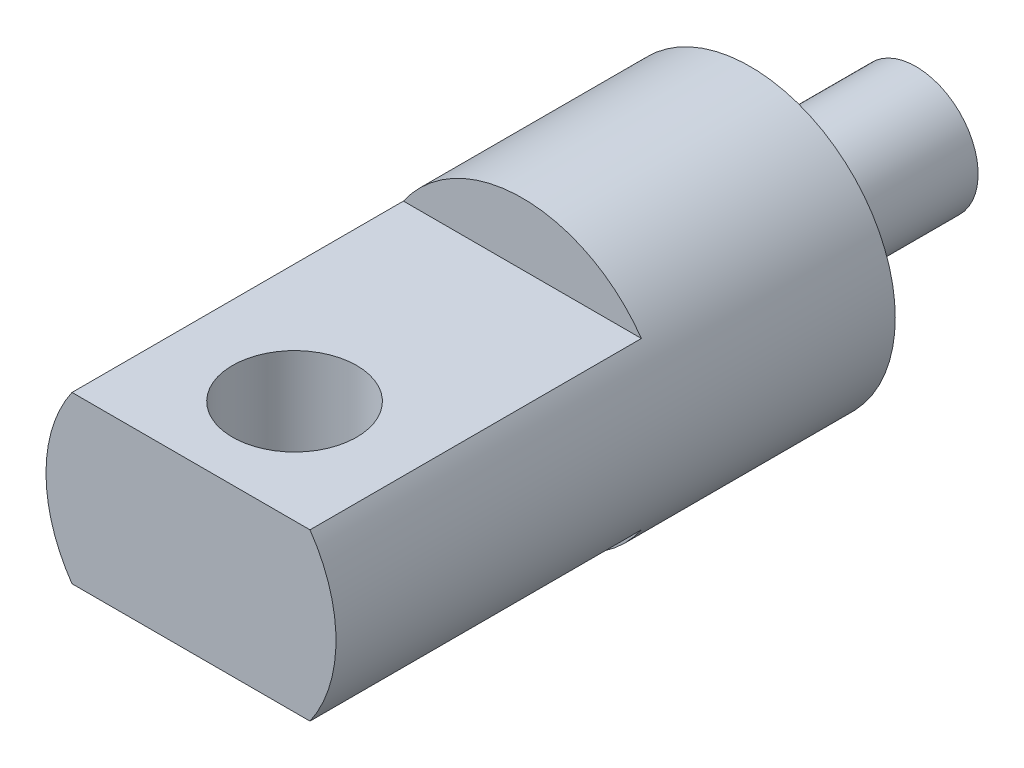
ISO-10303-21;
HEADER;
FILE_DESCRIPTION(('STEP AP214'),'2;1');
FILE_NAME('part.step','',(''),(''),'','','');
FILE_SCHEMA(('AUTOMOTIVE_DESIGN { 1 0 10303 214 1 1 1 1 }'));
ENDSEC;
DATA;
#1=APPLICATION_CONTEXT('core data for automotive mechanical design processes');
#2=APPLICATION_PROTOCOL_DEFINITION('international standard','automotive_design',2000,#1);
#3=PRODUCT_CONTEXT('',#1,'mechanical');
#4=PRODUCT('Part','Part','',(#3));
#5=PRODUCT_RELATED_PRODUCT_CATEGORY('part','',(#4));
#6=PRODUCT_DEFINITION_FORMATION('','',#4);
#7=PRODUCT_DEFINITION_CONTEXT('part definition',#1,'design');
#8=PRODUCT_DEFINITION('design','',#6,#7);
#9=PRODUCT_DEFINITION_SHAPE('','',#8);
#10=(LENGTH_UNIT() NAMED_UNIT(*) SI_UNIT(.MILLI.,.METRE.));
#11=(NAMED_UNIT(*) PLANE_ANGLE_UNIT() SI_UNIT($,.RADIAN.));
#12=(NAMED_UNIT(*) SI_UNIT($,.STERADIAN.) SOLID_ANGLE_UNIT());
#13=UNCERTAINTY_MEASURE_WITH_UNIT(LENGTH_MEASURE(1.E-05),#10,'distance_accuracy_value','');
#14=(GEOMETRIC_REPRESENTATION_CONTEXT(3) GLOBAL_UNCERTAINTY_ASSIGNED_CONTEXT((#13)) GLOBAL_UNIT_ASSIGNED_CONTEXT((#10,
#11,#12)) REPRESENTATION_CONTEXT('',''));
#15=CARTESIAN_POINT('',(0.,0.,0.));
#16=DIRECTION('',(0.,0.,1.));
#17=DIRECTION('',(1.,0.,0.));
#18=AXIS2_PLACEMENT_3D('',#15,#16,#17);
#19=CARTESIAN_POINT('',(0.,0.,25.));
#20=DIRECTION('',(0.,0.,-1.));
#21=DIRECTION('',(-1.,0.,0.));
#22=AXIS2_PLACEMENT_3D('',#19,#20,#21);
#23=CYLINDRICAL_SURFACE('',#22,35.);
#24=CARTESIAN_POINT('',(0.,0.,25.));
#25=DIRECTION('',(0.,0.,1.));
#26=DIRECTION('',(1.,0.,0.));
#27=AXIS2_PLACEMENT_3D('',#24,#25,#26);
#28=CIRCLE('',#27,35.);
#29=CARTESIAN_POINT('',(-28.7228132326902,20.,25.));
#30=VERTEX_POINT('',#29);
#31=CARTESIAN_POINT('',(-28.7228132326902,-20.,25.));
#32=VERTEX_POINT('',#31);
#33=EDGE_CURVE('E11',#30,#32,#28,.T.);
#34=ORIENTED_EDGE('',*,*,#33,.F.);
#35=DIRECTION('',(0.,0.,1.));
#36=VECTOR('',#35,1.);
#37=CARTESIAN_POINT('',(-28.7228132326902,20.,-55.));
#38=LINE('',#37,#36);
#39=CARTESIAN_POINT('',(-28.7228132326902,20.,-55.));
#40=VERTEX_POINT('',#39);
#41=EDGE_CURVE('E62',#40,#30,#38,.T.);
#42=ORIENTED_EDGE('',*,*,#41,.F.);
#43=CARTESIAN_POINT('',(0.,0.,-55.));
#44=DIRECTION('',(0.,0.,1.));
#45=DIRECTION('',(1.,0.,0.));
#46=AXIS2_PLACEMENT_3D('',#43,#44,#45);
#47=CIRCLE('',#46,35.);
#48=CARTESIAN_POINT('',(28.7228132326902,20.,-55.));
#49=VERTEX_POINT('',#48);
#50=EDGE_CURVE('E82',#49,#40,#47,.T.);
#51=ORIENTED_EDGE('',*,*,#50,.F.);
#52=DIRECTION('',(0.,0.,1.));
#53=VECTOR('',#52,1.);
#54=CARTESIAN_POINT('',(28.7228132326902,20.,-55.));
#55=LINE('',#54,#53);
#56=CARTESIAN_POINT('',(28.7228132326902,20.,25.));
#57=VERTEX_POINT('',#56);
#58=EDGE_CURVE('E90',#49,#57,#55,.T.);
#59=ORIENTED_EDGE('',*,*,#58,.T.);
#60=CARTESIAN_POINT('',(28.7228132326902,-20.,25.));
#61=VERTEX_POINT('',#60);
#62=EDGE_CURVE('E47',#61,#57,#28,.T.);
#63=ORIENTED_EDGE('',*,*,#62,.F.);
#64=DIRECTION('',(0.,0.,1.));
#65=VECTOR('',#64,1.);
#66=CARTESIAN_POINT('',(28.7228132326902,-20.,-55.));
#67=LINE('',#66,#65);
#68=CARTESIAN_POINT('',(28.7228132326902,-20.,-55.));
#69=VERTEX_POINT('',#68);
#70=EDGE_CURVE('E54',#69,#61,#67,.T.);
#71=ORIENTED_EDGE('',*,*,#70,.F.);
#72=CARTESIAN_POINT('',(0.,0.,-55.));
#73=DIRECTION('',(0.,0.,1.));
#74=DIRECTION('',(1.,0.,0.));
#75=AXIS2_PLACEMENT_3D('',#72,#73,#74);
#76=CIRCLE('',#75,35.);
#77=CARTESIAN_POINT('',(-28.7228132326902,-20.,-55.));
#78=VERTEX_POINT('',#77);
#79=EDGE_CURVE('E106',#78,#69,#76,.T.);
#80=ORIENTED_EDGE('',*,*,#79,.F.);
#81=DIRECTION('',(0.,0.,1.));
#82=VECTOR('',#81,1.);
#83=CARTESIAN_POINT('',(-28.7228132326902,-20.,-55.));
#84=LINE('',#83,#82);
#85=EDGE_CURVE('E102',#78,#32,#84,.T.);
#86=ORIENTED_EDGE('',*,*,#85,.T.);
#87=EDGE_LOOP('',(#34,#42,#51,#59,#63,#71,#80,#86));
#88=FACE_BOUND('',#87,.T.);
#89=CARTESIAN_POINT('',(0.,0.,-110.));
#90=DIRECTION('',(0.,0.,-1.));
#91=DIRECTION('',(-1.,0.,0.));
#92=AXIS2_PLACEMENT_3D('',#89,#90,#91);
#93=CIRCLE('',#92,35.);
#94=CARTESIAN_POINT('',(-35.,0.,-110.));
#95=VERTEX_POINT('',#94);
#96=EDGE_CURVE('E113',#95,#95,#93,.T.);
#97=ORIENTED_EDGE('',*,*,#96,.F.);
#98=EDGE_LOOP('',(#97));
#99=FACE_BOUND('',#98,.T.);
#100=ADVANCED_FACE('F39',(#88,#99),#23,.T.);
#101=CARTESIAN_POINT('',(0.,0.,25.));
#102=DIRECTION('',(0.,0.,1.));
#103=DIRECTION('',(1.,0.,0.));
#104=AXIS2_PLACEMENT_3D('',#101,#102,#103);
#105=PLANE('',#104);
#106=DIRECTION('',(1.,0.,0.));
#107=VECTOR('',#106,1.);
#108=CARTESIAN_POINT('',(-28.7228132326902,20.,25.));
#109=LINE('',#108,#107);
#110=EDGE_CURVE('E87',#30,#57,#109,.T.);
#111=ORIENTED_EDGE('',*,*,#110,.F.);
#112=ORIENTED_EDGE('',*,*,#33,.T.);
#113=DIRECTION('',(-1.,0.,0.));
#114=VECTOR('',#113,1.);
#115=CARTESIAN_POINT('',(-28.7228132326902,-20.,25.));
#116=LINE('',#115,#114);
#117=EDGE_CURVE('E104',#61,#32,#116,.T.);
#118=ORIENTED_EDGE('',*,*,#117,.F.);
#119=ORIENTED_EDGE('',*,*,#62,.T.);
#120=EDGE_LOOP('',(#111,#112,#118,#119));
#121=FACE_BOUND('',#120,.T.);
#122=ADVANCED_FACE('F120',(#121),#105,.T.);
#123=CARTESIAN_POINT('',(0.,0.,-110.));
#124=DIRECTION('',(0.,0.,-1.));
#125=DIRECTION('',(-1.,0.,0.));
#126=AXIS2_PLACEMENT_3D('',#123,#124,#125);
#127=PLANE('',#126);
#128=CARTESIAN_POINT('',(0.,0.,-110.));
#129=DIRECTION('',(0.,0.,-1.));
#130=DIRECTION('',(-1.,0.,0.));
#131=AXIS2_PLACEMENT_3D('',#128,#129,#130);
#132=CIRCLE('',#131,15.);
#133=CARTESIAN_POINT('',(-15.,0.,-110.));
#134=VERTEX_POINT('',#133);
#135=EDGE_CURVE('E110',#134,#134,#132,.T.);
#136=ORIENTED_EDGE('',*,*,#135,.F.);
#137=EDGE_LOOP('',(#136));
#138=FACE_BOUND('',#137,.T.);
#139=ORIENTED_EDGE('',*,*,#96,.T.);
#140=EDGE_LOOP('',(#139));
#141=FACE_BOUND('',#140,.T.);
#142=ADVANCED_FACE('F145',(#138,#141),#127,.T.);
#143=CARTESIAN_POINT('',(0.,0.,-110.));
#144=DIRECTION('',(0.,0.,-1.));
#145=DIRECTION('',(-1.,0.,0.));
#146=AXIS2_PLACEMENT_3D('',#143,#144,#145);
#147=CYLINDRICAL_SURFACE('',#146,15.);
#148=ORIENTED_EDGE('',*,*,#135,.T.);
#149=EDGE_LOOP('',(#148));
#150=FACE_BOUND('',#149,.T.);
#151=CARTESIAN_POINT('',(0.,0.,-150.));
#152=DIRECTION('',(0.,0.,-1.));
#153=DIRECTION('',(-1.,0.,0.));
#154=AXIS2_PLACEMENT_3D('',#151,#152,#153);
#155=CIRCLE('',#154,15.);
#156=CARTESIAN_POINT('',(-15.,0.,-150.));
#157=VERTEX_POINT('',#156);
#158=EDGE_CURVE('E96',#157,#157,#155,.T.);
#159=ORIENTED_EDGE('',*,*,#158,.F.);
#160=EDGE_LOOP('',(#159));
#161=FACE_BOUND('',#160,.T.);
#162=ADVANCED_FACE('F136',(#150,#161),#147,.T.);
#163=CARTESIAN_POINT('',(0.,0.,-150.));
#164=DIRECTION('',(0.,0.,1.));
#165=DIRECTION('',(1.,0.,0.));
#166=AXIS2_PLACEMENT_3D('',#163,#164,#165);
#167=PLANE('',#166);
#168=ORIENTED_EDGE('',*,*,#158,.T.);
#169=EDGE_LOOP('',(#168));
#170=FACE_BOUND('',#169,.T.);
#171=ADVANCED_FACE('F126',(#170),#167,.F.);
#172=CARTESIAN_POINT('',(-28.7228132326902,-20.,-55.));
#173=DIRECTION('',(0.,1.,0.));
#174=DIRECTION('',(0.,0.,1.));
#175=AXIS2_PLACEMENT_3D('',#172,#173,#174);
#176=PLANE('',#175);
#177=CARTESIAN_POINT('',(0.,-20.,0.));
#178=DIRECTION('',(0.,-1.,0.));
#179=DIRECTION('',(0.,0.,-1.));
#180=AXIS2_PLACEMENT_3D('',#177,#178,#179);
#181=CIRCLE('',#180,15.);
#182=CARTESIAN_POINT('',(0.,-20.,-15.));
#183=VERTEX_POINT('',#182);
#184=EDGE_CURVE('E217',#183,#183,#181,.T.);
#185=ORIENTED_EDGE('',*,*,#184,.F.);
#186=EDGE_LOOP('',(#185));
#187=FACE_BOUND('',#186,.T.);
#188=ORIENTED_EDGE('',*,*,#117,.T.);
#189=ORIENTED_EDGE('',*,*,#85,.F.);
#190=DIRECTION('',(-1.,0.,0.));
#191=VECTOR('',#190,1.);
#192=CARTESIAN_POINT('',(-28.7228132326902,-20.,-55.));
#193=LINE('',#192,#191);
#194=EDGE_CURVE('E101',#69,#78,#193,.T.);
#195=ORIENTED_EDGE('',*,*,#194,.F.);
#196=ORIENTED_EDGE('',*,*,#70,.T.);
#197=EDGE_LOOP('',(#188,#189,#195,#196));
#198=FACE_BOUND('',#197,.T.);
#199=ADVANCED_FACE('F124',(#187,#198),#176,.F.);
#200=CARTESIAN_POINT('',(0.,0.,-55.));
#201=DIRECTION('',(0.,0.,1.));
#202=DIRECTION('',(1.,0.,0.));
#203=AXIS2_PLACEMENT_3D('',#200,#201,#202);
#204=PLANE('',#203);
#205=ORIENTED_EDGE('',*,*,#79,.T.);
#206=ORIENTED_EDGE('',*,*,#194,.T.);
#207=EDGE_LOOP('',(#205,#206));
#208=FACE_BOUND('',#207,.T.);
#209=ADVANCED_FACE('F123',(#208),#204,.T.);
#210=CARTESIAN_POINT('',(-28.7228132326902,20.,-55.));
#211=DIRECTION('',(0.,-1.,0.));
#212=DIRECTION('',(0.,0.,-1.));
#213=AXIS2_PLACEMENT_3D('',#210,#211,#212);
#214=PLANE('',#213);
#215=CARTESIAN_POINT('',(0.,20.,0.));
#216=DIRECTION('',(0.,-1.,0.));
#217=DIRECTION('',(0.,0.,-1.));
#218=AXIS2_PLACEMENT_3D('',#215,#216,#217);
#219=CIRCLE('',#218,15.);
#220=CARTESIAN_POINT('',(0.,20.,-15.));
#221=VERTEX_POINT('',#220);
#222=EDGE_CURVE('E42',#221,#221,#219,.T.);
#223=ORIENTED_EDGE('',*,*,#222,.T.);
#224=EDGE_LOOP('',(#223));
#225=FACE_BOUND('',#224,.T.);
#226=ORIENTED_EDGE('',*,*,#110,.T.);
#227=ORIENTED_EDGE('',*,*,#58,.F.);
#228=DIRECTION('',(1.,0.,0.));
#229=VECTOR('',#228,1.);
#230=CARTESIAN_POINT('',(-28.7228132326902,20.,-55.));
#231=LINE('',#230,#229);
#232=EDGE_CURVE('E84',#40,#49,#231,.T.);
#233=ORIENTED_EDGE('',*,*,#232,.F.);
#234=ORIENTED_EDGE('',*,*,#41,.T.);
#235=EDGE_LOOP('',(#226,#227,#233,#234));
#236=FACE_BOUND('',#235,.T.);
#237=ADVANCED_FACE('F89',(#225,#236),#214,.F.);
#238=CARTESIAN_POINT('',(0.,0.,-55.));
#239=DIRECTION('',(0.,0.,1.));
#240=DIRECTION('',(1.,0.,0.));
#241=AXIS2_PLACEMENT_3D('',#238,#239,#240);
#242=PLANE('',#241);
#243=ORIENTED_EDGE('',*,*,#50,.T.);
#244=ORIENTED_EDGE('',*,*,#232,.T.);
#245=EDGE_LOOP('',(#243,#244));
#246=FACE_BOUND('',#245,.T.);
#247=ADVANCED_FACE('F83',(#246),#242,.T.);
#248=CARTESIAN_POINT('',(0.,35.,0.));
#249=DIRECTION('',(0.,-1.,0.));
#250=DIRECTION('',(0.,0.,-1.));
#251=AXIS2_PLACEMENT_3D('',#248,#249,#250);
#252=CYLINDRICAL_SURFACE('',#251,15.);
#253=ORIENTED_EDGE('',*,*,#184,.T.);
#254=EDGE_LOOP('',(#253));
#255=FACE_BOUND('',#254,.T.);
#256=ORIENTED_EDGE('',*,*,#222,.F.);
#257=EDGE_LOOP('',(#256));
#258=FACE_BOUND('',#257,.T.);
#259=ADVANCED_FACE('F202',(#255,#258),#252,.F.);
#260=CLOSED_SHELL('',(#100,#122,#142,#162,#171,#199,#209,#237,#247,#259));
#261=MANIFOLD_SOLID_BREP('B2',#260);
#262=ADVANCED_BREP_SHAPE_REPRESENTATION('',(#18,#261),#14);
#263=SHAPE_DEFINITION_REPRESENTATION(#9,#262);
ENDSEC;
END-ISO-10303-21;
